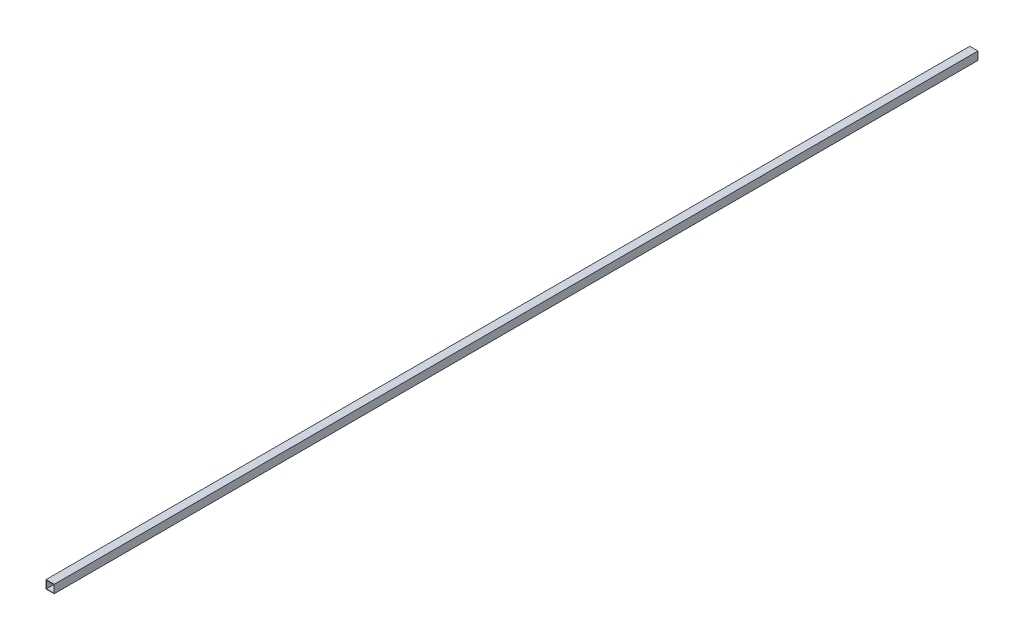
ISO-10303-21;
HEADER;
FILE_DESCRIPTION(('STEP AP214'),'2;1');
FILE_NAME('part.step','',(''),(''),'','','');
FILE_SCHEMA(('AUTOMOTIVE_DESIGN { 1 0 10303 214 1 1 1 1 }'));
ENDSEC;
DATA;
#1=APPLICATION_CONTEXT('core data for automotive mechanical design processes');
#2=APPLICATION_PROTOCOL_DEFINITION('international standard','automotive_design',2000,#1);
#3=PRODUCT_CONTEXT('',#1,'mechanical');
#4=PRODUCT('Part','Part','',(#3));
#5=PRODUCT_RELATED_PRODUCT_CATEGORY('part','',(#4));
#6=PRODUCT_DEFINITION_FORMATION('','',#4);
#7=PRODUCT_DEFINITION_CONTEXT('part definition',#1,'design');
#8=PRODUCT_DEFINITION('design','',#6,#7);
#9=PRODUCT_DEFINITION_SHAPE('','',#8);
#10=(LENGTH_UNIT() NAMED_UNIT(*) SI_UNIT(.MILLI.,.METRE.));
#11=(NAMED_UNIT(*) PLANE_ANGLE_UNIT() SI_UNIT($,.RADIAN.));
#12=(NAMED_UNIT(*) SI_UNIT($,.STERADIAN.) SOLID_ANGLE_UNIT());
#13=UNCERTAINTY_MEASURE_WITH_UNIT(LENGTH_MEASURE(1.E-05),#10,'distance_accuracy_value','');
#14=(GEOMETRIC_REPRESENTATION_CONTEXT(3) GLOBAL_UNCERTAINTY_ASSIGNED_CONTEXT((#13)) GLOBAL_UNIT_ASSIGNED_CONTEXT((#10,
#11,#12)) REPRESENTATION_CONTEXT('',''));
#15=CARTESIAN_POINT('',(0.,0.,0.));
#16=DIRECTION('',(0.,0.,1.));
#17=DIRECTION('',(1.,0.,0.));
#18=AXIS2_PLACEMENT_3D('',#15,#16,#17);
#19=CARTESIAN_POINT('',(0.,0.,2250.));
#20=DIRECTION('',(0.,0.,-1.));
#21=DIRECTION('',(-1.,0.,0.));
#22=AXIS2_PLACEMENT_3D('',#19,#20,#21);
#23=PLANE('',#22);
#24=DIRECTION('',(0.,-1.,0.));
#25=VECTOR('',#24,1.);
#26=CARTESIAN_POINT('',(0.,0.,2250.));
#27=LINE('',#26,#25);
#28=CARTESIAN_POINT('',(0.,20.,2250.));
#29=VERTEX_POINT('',#28);
#30=CARTESIAN_POINT('',(0.,0.,2250.));
#31=VERTEX_POINT('',#30);
#32=EDGE_CURVE('E136',#29,#31,#27,.T.);
#33=ORIENTED_EDGE('',*,*,#32,.T.);
#34=DIRECTION('',(1.,0.,0.));
#35=VECTOR('',#34,1.);
#36=CARTESIAN_POINT('',(0.,0.,2250.));
#37=LINE('',#36,#35);
#38=CARTESIAN_POINT('',(20.,0.,2250.));
#39=VERTEX_POINT('',#38);
#40=EDGE_CURVE('E139',#31,#39,#37,.T.);
#41=ORIENTED_EDGE('',*,*,#40,.T.);
#42=DIRECTION('',(0.,1.,0.));
#43=VECTOR('',#42,1.);
#44=CARTESIAN_POINT('',(20.,0.,2250.));
#45=LINE('',#44,#43);
#46=CARTESIAN_POINT('',(20.,20.,2250.));
#47=VERTEX_POINT('',#46);
#48=EDGE_CURVE('E142',#39,#47,#45,.T.);
#49=ORIENTED_EDGE('',*,*,#48,.T.);
#50=DIRECTION('',(-1.,0.,0.));
#51=VECTOR('',#50,1.);
#52=CARTESIAN_POINT('',(0.,20.,2250.));
#53=LINE('',#52,#51);
#54=EDGE_CURVE('E144',#47,#29,#53,.T.);
#55=ORIENTED_EDGE('',*,*,#54,.T.);
#56=EDGE_LOOP('',(#33,#41,#49,#55));
#57=FACE_BOUND('',#56,.T.);
#58=DIRECTION('',(0.,-1.,0.));
#59=VECTOR('',#58,1.);
#60=CARTESIAN_POINT('',(1.,1.,2250.));
#61=LINE('',#60,#59);
#62=CARTESIAN_POINT('',(1.,19.,2250.));
#63=VERTEX_POINT('',#62);
#64=CARTESIAN_POINT('',(1.,1.,2250.));
#65=VERTEX_POINT('',#64);
#66=EDGE_CURVE('E100',#63,#65,#61,.T.);
#67=ORIENTED_EDGE('',*,*,#66,.F.);
#68=DIRECTION('',(-1.,0.,0.));
#69=VECTOR('',#68,1.);
#70=CARTESIAN_POINT('',(1.,19.,2250.));
#71=LINE('',#70,#69);
#72=CARTESIAN_POINT('',(19.,19.,2250.));
#73=VERTEX_POINT('',#72);
#74=EDGE_CURVE('E122',#73,#63,#71,.T.);
#75=ORIENTED_EDGE('',*,*,#74,.F.);
#76=DIRECTION('',(0.,1.,0.));
#77=VECTOR('',#76,1.);
#78=CARTESIAN_POINT('',(19.,1.,2250.));
#79=LINE('',#78,#77);
#80=CARTESIAN_POINT('',(19.,1.,2250.));
#81=VERTEX_POINT('',#80);
#82=EDGE_CURVE('E120',#81,#73,#79,.T.);
#83=ORIENTED_EDGE('',*,*,#82,.F.);
#84=DIRECTION('',(1.,0.,0.));
#85=VECTOR('',#84,1.);
#86=CARTESIAN_POINT('',(1.,1.,2250.));
#87=LINE('',#86,#85);
#88=EDGE_CURVE('E108',#65,#81,#87,.T.);
#89=ORIENTED_EDGE('',*,*,#88,.F.);
#90=EDGE_LOOP('',(#67,#75,#83,#89));
#91=FACE_BOUND('',#90,.T.);
#92=ADVANCED_FACE('F35',(#57,#91),#23,.F.);
#93=CARTESIAN_POINT('',(0.,0.,0.));
#94=DIRECTION('',(0.,0.,-1.));
#95=DIRECTION('',(-1.,0.,0.));
#96=AXIS2_PLACEMENT_3D('',#93,#94,#95);
#97=PLANE('',#96);
#98=DIRECTION('',(0.,-1.,0.));
#99=VECTOR('',#98,1.);
#100=CARTESIAN_POINT('',(0.,0.,0.));
#101=LINE('',#100,#99);
#102=CARTESIAN_POINT('',(0.,20.,0.));
#103=VERTEX_POINT('',#102);
#104=CARTESIAN_POINT('',(0.,0.,0.));
#105=VERTEX_POINT('',#104);
#106=EDGE_CURVE('E116',#103,#105,#101,.T.);
#107=ORIENTED_EDGE('',*,*,#106,.F.);
#108=DIRECTION('',(-1.,0.,0.));
#109=VECTOR('',#108,1.);
#110=CARTESIAN_POINT('',(0.,20.,0.));
#111=LINE('',#110,#109);
#112=CARTESIAN_POINT('',(20.,20.,0.));
#113=VERTEX_POINT('',#112);
#114=EDGE_CURVE('E140',#113,#103,#111,.T.);
#115=ORIENTED_EDGE('',*,*,#114,.F.);
#116=DIRECTION('',(0.,1.,0.));
#117=VECTOR('',#116,1.);
#118=CARTESIAN_POINT('',(20.,0.,0.));
#119=LINE('',#118,#117);
#120=CARTESIAN_POINT('',(20.,0.,0.));
#121=VERTEX_POINT('',#120);
#122=EDGE_CURVE('E151',#121,#113,#119,.T.);
#123=ORIENTED_EDGE('',*,*,#122,.F.);
#124=DIRECTION('',(1.,0.,0.));
#125=VECTOR('',#124,1.);
#126=CARTESIAN_POINT('',(0.,0.,0.));
#127=LINE('',#126,#125);
#128=EDGE_CURVE('E149',#105,#121,#127,.T.);
#129=ORIENTED_EDGE('',*,*,#128,.F.);
#130=EDGE_LOOP('',(#107,#115,#123,#129));
#131=FACE_BOUND('',#130,.T.);
#132=DIRECTION('',(-1.,0.,0.));
#133=VECTOR('',#132,1.);
#134=CARTESIAN_POINT('',(1.,19.,0.));
#135=LINE('',#134,#133);
#136=CARTESIAN_POINT('',(19.,19.,0.));
#137=VERTEX_POINT('',#136);
#138=CARTESIAN_POINT('',(1.,19.,0.));
#139=VERTEX_POINT('',#138);
#140=EDGE_CURVE('E109',#137,#139,#135,.T.);
#141=ORIENTED_EDGE('',*,*,#140,.T.);
#142=DIRECTION('',(0.,-1.,0.));
#143=VECTOR('',#142,1.);
#144=CARTESIAN_POINT('',(1.,1.,0.));
#145=LINE('',#144,#143);
#146=CARTESIAN_POINT('',(1.,1.,0.));
#147=VERTEX_POINT('',#146);
#148=EDGE_CURVE('E58',#139,#147,#145,.T.);
#149=ORIENTED_EDGE('',*,*,#148,.T.);
#150=DIRECTION('',(1.,0.,0.));
#151=VECTOR('',#150,1.);
#152=CARTESIAN_POINT('',(1.,1.,0.));
#153=LINE('',#152,#151);
#154=CARTESIAN_POINT('',(19.,1.,0.));
#155=VERTEX_POINT('',#154);
#156=EDGE_CURVE('E115',#147,#155,#153,.T.);
#157=ORIENTED_EDGE('',*,*,#156,.T.);
#158=DIRECTION('',(0.,1.,0.));
#159=VECTOR('',#158,1.);
#160=CARTESIAN_POINT('',(19.,1.,0.));
#161=LINE('',#160,#159);
#162=EDGE_CURVE('E128',#155,#137,#161,.T.);
#163=ORIENTED_EDGE('',*,*,#162,.T.);
#164=EDGE_LOOP('',(#141,#149,#157,#163));
#165=FACE_BOUND('',#164,.T.);
#166=ADVANCED_FACE('F169',(#131,#165),#97,.T.);
#167=CARTESIAN_POINT('',(0.,0.,2250.));
#168=DIRECTION('',(1.,0.,0.));
#169=DIRECTION('',(0.,0.,-1.));
#170=AXIS2_PLACEMENT_3D('',#167,#168,#169);
#171=PLANE('',#170);
#172=ORIENTED_EDGE('',*,*,#106,.T.);
#173=DIRECTION('',(0.,0.,-1.));
#174=VECTOR('',#173,1.);
#175=CARTESIAN_POINT('',(0.,0.,2250.));
#176=LINE('',#175,#174);
#177=EDGE_CURVE('E11',#31,#105,#176,.T.);
#178=ORIENTED_EDGE('',*,*,#177,.F.);
#179=ORIENTED_EDGE('',*,*,#32,.F.);
#180=DIRECTION('',(0.,0.,-1.));
#181=VECTOR('',#180,1.);
#182=CARTESIAN_POINT('',(0.,20.,2250.));
#183=LINE('',#182,#181);
#184=EDGE_CURVE('E146',#29,#103,#183,.T.);
#185=ORIENTED_EDGE('',*,*,#184,.T.);
#186=EDGE_LOOP('',(#172,#178,#179,#185));
#187=FACE_BOUND('',#186,.T.);
#188=ADVANCED_FACE('F37',(#187),#171,.F.);
#189=CARTESIAN_POINT('',(0.,0.,2250.));
#190=DIRECTION('',(0.,1.,0.));
#191=DIRECTION('',(0.,0.,1.));
#192=AXIS2_PLACEMENT_3D('',#189,#190,#191);
#193=PLANE('',#192);
#194=ORIENTED_EDGE('',*,*,#128,.T.);
#195=DIRECTION('',(0.,0.,-1.));
#196=VECTOR('',#195,1.);
#197=CARTESIAN_POINT('',(20.,0.,2250.));
#198=LINE('',#197,#196);
#199=EDGE_CURVE('E43',#39,#121,#198,.T.);
#200=ORIENTED_EDGE('',*,*,#199,.F.);
#201=ORIENTED_EDGE('',*,*,#40,.F.);
#202=ORIENTED_EDGE('',*,*,#177,.T.);
#203=EDGE_LOOP('',(#194,#200,#201,#202));
#204=FACE_BOUND('',#203,.T.);
#205=ADVANCED_FACE('F179',(#204),#193,.F.);
#206=CARTESIAN_POINT('',(20.,0.,2250.));
#207=DIRECTION('',(-1.,0.,0.));
#208=DIRECTION('',(0.,0.,1.));
#209=AXIS2_PLACEMENT_3D('',#206,#207,#208);
#210=PLANE('',#209);
#211=ORIENTED_EDGE('',*,*,#122,.T.);
#212=DIRECTION('',(0.,0.,-1.));
#213=VECTOR('',#212,1.);
#214=CARTESIAN_POINT('',(20.,20.,2250.));
#215=LINE('',#214,#213);
#216=EDGE_CURVE('E156',#47,#113,#215,.T.);
#217=ORIENTED_EDGE('',*,*,#216,.F.);
#218=ORIENTED_EDGE('',*,*,#48,.F.);
#219=ORIENTED_EDGE('',*,*,#199,.T.);
#220=EDGE_LOOP('',(#211,#217,#218,#219));
#221=FACE_BOUND('',#220,.T.);
#222=ADVANCED_FACE('F163',(#221),#210,.F.);
#223=CARTESIAN_POINT('',(0.,20.,2250.));
#224=DIRECTION('',(0.,-1.,0.));
#225=DIRECTION('',(0.,0.,-1.));
#226=AXIS2_PLACEMENT_3D('',#223,#224,#225);
#227=PLANE('',#226);
#228=ORIENTED_EDGE('',*,*,#114,.T.);
#229=ORIENTED_EDGE('',*,*,#184,.F.);
#230=ORIENTED_EDGE('',*,*,#54,.F.);
#231=ORIENTED_EDGE('',*,*,#216,.T.);
#232=EDGE_LOOP('',(#228,#229,#230,#231));
#233=FACE_BOUND('',#232,.T.);
#234=ADVANCED_FACE('F173',(#233),#227,.F.);
#235=CARTESIAN_POINT('',(1.,1.,2250.));
#236=DIRECTION('',(1.,0.,0.));
#237=DIRECTION('',(0.,0.,-1.));
#238=AXIS2_PLACEMENT_3D('',#235,#236,#237);
#239=PLANE('',#238);
#240=ORIENTED_EDGE('',*,*,#148,.F.);
#241=DIRECTION('',(0.,0.,-1.));
#242=VECTOR('',#241,1.);
#243=CARTESIAN_POINT('',(1.,19.,2250.));
#244=LINE('',#243,#242);
#245=EDGE_CURVE('E104',#63,#139,#244,.T.);
#246=ORIENTED_EDGE('',*,*,#245,.F.);
#247=ORIENTED_EDGE('',*,*,#66,.T.);
#248=DIRECTION('',(0.,0.,-1.));
#249=VECTOR('',#248,1.);
#250=CARTESIAN_POINT('',(1.,1.,2250.));
#251=LINE('',#250,#249);
#252=EDGE_CURVE('E103',#65,#147,#251,.T.);
#253=ORIENTED_EDGE('',*,*,#252,.T.);
#254=EDGE_LOOP('',(#240,#246,#247,#253));
#255=FACE_BOUND('',#254,.T.);
#256=ADVANCED_FACE('F102',(#255),#239,.T.);
#257=CARTESIAN_POINT('',(1.,1.,2250.));
#258=DIRECTION('',(0.,1.,0.));
#259=DIRECTION('',(0.,0.,1.));
#260=AXIS2_PLACEMENT_3D('',#257,#258,#259);
#261=PLANE('',#260);
#262=ORIENTED_EDGE('',*,*,#156,.F.);
#263=ORIENTED_EDGE('',*,*,#252,.F.);
#264=ORIENTED_EDGE('',*,*,#88,.T.);
#265=DIRECTION('',(0.,0.,-1.));
#266=VECTOR('',#265,1.);
#267=CARTESIAN_POINT('',(19.,1.,2250.));
#268=LINE('',#267,#266);
#269=EDGE_CURVE('E117',#81,#155,#268,.T.);
#270=ORIENTED_EDGE('',*,*,#269,.T.);
#271=EDGE_LOOP('',(#262,#263,#264,#270));
#272=FACE_BOUND('',#271,.T.);
#273=ADVANCED_FACE('F112',(#272),#261,.T.);
#274=CARTESIAN_POINT('',(19.,1.,2250.));
#275=DIRECTION('',(-1.,0.,0.));
#276=DIRECTION('',(0.,0.,1.));
#277=AXIS2_PLACEMENT_3D('',#274,#275,#276);
#278=PLANE('',#277);
#279=ORIENTED_EDGE('',*,*,#162,.F.);
#280=ORIENTED_EDGE('',*,*,#269,.F.);
#281=ORIENTED_EDGE('',*,*,#82,.T.);
#282=DIRECTION('',(0.,0.,-1.));
#283=VECTOR('',#282,1.);
#284=CARTESIAN_POINT('',(19.,19.,2250.));
#285=LINE('',#284,#283);
#286=EDGE_CURVE('E50',#73,#137,#285,.T.);
#287=ORIENTED_EDGE('',*,*,#286,.T.);
#288=EDGE_LOOP('',(#279,#280,#281,#287));
#289=FACE_BOUND('',#288,.T.);
#290=ADVANCED_FACE('F202',(#289),#278,.T.);
#291=CARTESIAN_POINT('',(1.,19.,2250.));
#292=DIRECTION('',(0.,-1.,0.));
#293=DIRECTION('',(0.,0.,-1.));
#294=AXIS2_PLACEMENT_3D('',#291,#292,#293);
#295=PLANE('',#294);
#296=ORIENTED_EDGE('',*,*,#140,.F.);
#297=ORIENTED_EDGE('',*,*,#286,.F.);
#298=ORIENTED_EDGE('',*,*,#74,.T.);
#299=ORIENTED_EDGE('',*,*,#245,.T.);
#300=EDGE_LOOP('',(#296,#297,#298,#299));
#301=FACE_BOUND('',#300,.T.);
#302=ADVANCED_FACE('F206',(#301),#295,.T.);
#303=CLOSED_SHELL('',(#92,#166,#188,#205,#222,#234,#256,#273,#290,#302));
#304=MANIFOLD_SOLID_BREP('B2',#303);
#305=ADVANCED_BREP_SHAPE_REPRESENTATION('',(#18,#304),#14);
#306=SHAPE_DEFINITION_REPRESENTATION(#9,#305);
ENDSEC;
END-ISO-10303-21;
